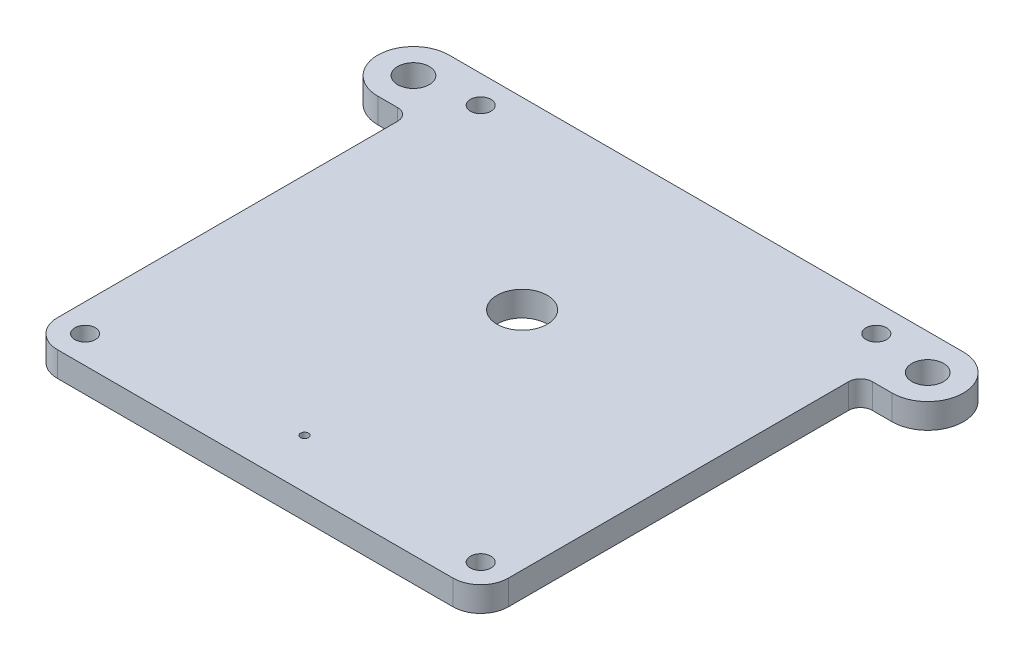
ISO-10303-21;
HEADER;
FILE_DESCRIPTION(('STEP AP214'),'2;1');
FILE_NAME('part.step','',(''),(''),'','','');
FILE_SCHEMA(('AUTOMOTIVE_DESIGN { 1 0 10303 214 1 1 1 1 }'));
ENDSEC;
DATA;
#1=APPLICATION_CONTEXT('core data for automotive mechanical design processes');
#2=APPLICATION_PROTOCOL_DEFINITION('international standard','automotive_design',2000,#1);
#3=PRODUCT_CONTEXT('',#1,'mechanical');
#4=PRODUCT('Part','Part','',(#3));
#5=PRODUCT_RELATED_PRODUCT_CATEGORY('part','',(#4));
#6=PRODUCT_DEFINITION_FORMATION('','',#4);
#7=PRODUCT_DEFINITION_CONTEXT('part definition',#1,'design');
#8=PRODUCT_DEFINITION('design','',#6,#7);
#9=PRODUCT_DEFINITION_SHAPE('','',#8);
#10=(LENGTH_UNIT() NAMED_UNIT(*) SI_UNIT(.MILLI.,.METRE.));
#11=(NAMED_UNIT(*) PLANE_ANGLE_UNIT() SI_UNIT($,.RADIAN.));
#12=(NAMED_UNIT(*) SI_UNIT($,.STERADIAN.) SOLID_ANGLE_UNIT());
#13=UNCERTAINTY_MEASURE_WITH_UNIT(LENGTH_MEASURE(1.E-05),#10,'distance_accuracy_value','');
#14=(GEOMETRIC_REPRESENTATION_CONTEXT(3) GLOBAL_UNCERTAINTY_ASSIGNED_CONTEXT((#13)) GLOBAL_UNIT_ASSIGNED_CONTEXT((#10,
#11,#12)) REPRESENTATION_CONTEXT('',''));
#15=CARTESIAN_POINT('',(0.,0.,0.));
#16=DIRECTION('',(0.,0.,1.));
#17=DIRECTION('',(1.,0.,0.));
#18=AXIS2_PLACEMENT_3D('',#15,#16,#17);
#19=CARTESIAN_POINT('',(65.,6.3,9.));
#20=DIRECTION('',(0.,-1.,0.));
#21=DIRECTION('',(0.,0.,-1.));
#22=AXIS2_PLACEMENT_3D('',#19,#20,#21);
#23=PLANE('',#22);
#24=CARTESIAN_POINT('',(65.,6.3,9.));
#25=DIRECTION('',(0.,1.,0.));
#26=DIRECTION('',(0.,0.,-1.));
#27=AXIS2_PLACEMENT_3D('',#24,#25,#26);
#28=CIRCLE('',#27,9.);
#29=CARTESIAN_POINT('',(65.,6.3,18.));
#30=VERTEX_POINT('',#29);
#31=CARTESIAN_POINT('',(65.,6.3,0.));
#32=VERTEX_POINT('',#31);
#33=EDGE_CURVE('E202',#30,#32,#28,.T.);
#34=ORIENTED_EDGE('',*,*,#33,.T.);
#35=DIRECTION('',(-1.,0.,0.));
#36=VECTOR('',#35,1.);
#37=CARTESIAN_POINT('',(-65.,6.3,0.));
#38=LINE('',#37,#36);
#39=CARTESIAN_POINT('',(-65.,6.3,0.));
#40=VERTEX_POINT('',#39);
#41=EDGE_CURVE('E114',#32,#40,#38,.T.);
#42=ORIENTED_EDGE('',*,*,#41,.T.);
#43=CARTESIAN_POINT('',(-65.,6.3,9.00000000000002));
#44=DIRECTION('',(0.,1.,0.));
#45=DIRECTION('',(0.,0.,1.));
#46=AXIS2_PLACEMENT_3D('',#43,#44,#45);
#47=CIRCLE('',#46,9.);
#48=CARTESIAN_POINT('',(-65.,6.3,18.));
#49=VERTEX_POINT('',#48);
#50=EDGE_CURVE('E239',#40,#49,#47,.T.);
#51=ORIENTED_EDGE('',*,*,#50,.T.);
#52=DIRECTION('',(1.,0.,0.));
#53=VECTOR('',#52,1.);
#54=CARTESIAN_POINT('',(-65.,6.3,18.));
#55=LINE('',#54,#53);
#56=CARTESIAN_POINT('',(-60.,6.3,18.));
#57=VERTEX_POINT('',#56);
#58=EDGE_CURVE('E259',#49,#57,#55,.T.);
#59=ORIENTED_EDGE('',*,*,#58,.T.);
#60=CARTESIAN_POINT('',(-60.,6.3,21.));
#61=DIRECTION('',(0.,-1.,0.));
#62=DIRECTION('',(0.,0.,-1.));
#63=AXIS2_PLACEMENT_3D('',#60,#61,#62);
#64=CIRCLE('',#63,3.);
#65=CARTESIAN_POINT('',(-57.,6.3,21.));
#66=VERTEX_POINT('',#65);
#67=EDGE_CURVE('E255',#57,#66,#64,.T.);
#68=ORIENTED_EDGE('',*,*,#67,.T.);
#69=DIRECTION('',(0.,0.,1.));
#70=VECTOR('',#69,1.);
#71=CARTESIAN_POINT('',(-57.,6.3,21.));
#72=LINE('',#71,#70);
#73=CARTESIAN_POINT('',(-57.,6.3,107.));
#74=VERTEX_POINT('',#73);
#75=EDGE_CURVE('E258',#66,#74,#72,.T.);
#76=ORIENTED_EDGE('',*,*,#75,.T.);
#77=CARTESIAN_POINT('',(-50.,6.3,107.));
#78=DIRECTION('',(0.,1.,0.));
#79=DIRECTION('',(0.,0.,1.));
#80=AXIS2_PLACEMENT_3D('',#77,#78,#79);
#81=CIRCLE('',#80,7.00000000000001);
#82=CARTESIAN_POINT('',(-50.,6.3,114.));
#83=VERTEX_POINT('',#82);
#84=EDGE_CURVE('E263',#74,#83,#81,.T.);
#85=ORIENTED_EDGE('',*,*,#84,.T.);
#86=DIRECTION('',(1.,0.,0.));
#87=VECTOR('',#86,1.);
#88=CARTESIAN_POINT('',(50.,6.3,114.));
#89=LINE('',#88,#87);
#90=CARTESIAN_POINT('',(50.,6.3,114.));
#91=VERTEX_POINT('',#90);
#92=EDGE_CURVE('E270',#83,#91,#89,.T.);
#93=ORIENTED_EDGE('',*,*,#92,.T.);
#94=CARTESIAN_POINT('',(50.,6.3,107.));
#95=DIRECTION('',(0.,1.,0.));
#96=DIRECTION('',(0.,0.,-1.));
#97=AXIS2_PLACEMENT_3D('',#94,#95,#96);
#98=CIRCLE('',#97,7.00000000000001);
#99=CARTESIAN_POINT('',(57.,6.3,107.));
#100=VERTEX_POINT('',#99);
#101=EDGE_CURVE('E145',#91,#100,#98,.T.);
#102=ORIENTED_EDGE('',*,*,#101,.T.);
#103=DIRECTION('',(0.,0.,-1.));
#104=VECTOR('',#103,1.);
#105=CARTESIAN_POINT('',(57.,6.3,21.));
#106=LINE('',#105,#104);
#107=CARTESIAN_POINT('',(57.,6.3,21.));
#108=VERTEX_POINT('',#107);
#109=EDGE_CURVE('E139',#100,#108,#106,.T.);
#110=ORIENTED_EDGE('',*,*,#109,.T.);
#111=CARTESIAN_POINT('',(60.,6.3,21.));
#112=DIRECTION('',(0.,-1.,0.));
#113=DIRECTION('',(0.,0.,1.));
#114=AXIS2_PLACEMENT_3D('',#111,#112,#113);
#115=CIRCLE('',#114,3.);
#116=CARTESIAN_POINT('',(60.,6.3,18.));
#117=VERTEX_POINT('',#116);
#118=EDGE_CURVE('E143',#108,#117,#115,.T.);
#119=ORIENTED_EDGE('',*,*,#118,.T.);
#120=DIRECTION('',(1.,0.,0.));
#121=VECTOR('',#120,1.);
#122=CARTESIAN_POINT('',(65.,6.3,18.));
#123=LINE('',#122,#121);
#124=EDGE_CURVE('E59',#117,#30,#123,.T.);
#125=ORIENTED_EDGE('',*,*,#124,.T.);
#126=EDGE_LOOP('',(#34,#42,#51,#59,#68,#76,#85,#93,#102,#110,#119,#125));
#127=FACE_BOUND('',#126,.T.);
#128=CARTESIAN_POINT('',(50.,6.3,7.));
#129=DIRECTION('',(0.,1.,0.));
#130=DIRECTION('',(0.,0.,1.));
#131=AXIS2_PLACEMENT_3D('',#128,#129,#130);
#132=CIRCLE('',#131,2.6);
#133=CARTESIAN_POINT('',(50.,6.3,9.6));
#134=VERTEX_POINT('',#133);
#135=EDGE_CURVE('E172',#134,#134,#132,.T.);
#136=ORIENTED_EDGE('',*,*,#135,.F.);
#137=EDGE_LOOP('',(#136));
#138=FACE_BOUND('',#137,.T.);
#139=CARTESIAN_POINT('',(65.,6.3,9.));
#140=DIRECTION('',(0.,1.,0.));
#141=DIRECTION('',(0.,0.,1.));
#142=AXIS2_PLACEMENT_3D('',#139,#140,#141);
#143=CIRCLE('',#142,4.00000000000001);
#144=CARTESIAN_POINT('',(65.,6.3,13.));
#145=VERTEX_POINT('',#144);
#146=EDGE_CURVE('E388',#145,#145,#143,.T.);
#147=ORIENTED_EDGE('',*,*,#146,.F.);
#148=EDGE_LOOP('',(#147));
#149=FACE_BOUND('',#148,.T.);
#150=CARTESIAN_POINT('',(50.,6.3,107.));
#151=DIRECTION('',(0.,1.,0.));
#152=DIRECTION('',(0.,0.,1.));
#153=AXIS2_PLACEMENT_3D('',#150,#151,#152);
#154=CIRCLE('',#153,2.6);
#155=CARTESIAN_POINT('',(50.,6.3,109.6));
#156=VERTEX_POINT('',#155);
#157=EDGE_CURVE('E380',#156,#156,#154,.T.);
#158=ORIENTED_EDGE('',*,*,#157,.F.);
#159=EDGE_LOOP('',(#158));
#160=FACE_BOUND('',#159,.T.);
#161=CARTESIAN_POINT('',(-50.,6.3,107.));
#162=DIRECTION('',(0.,1.,0.));
#163=DIRECTION('',(0.,0.,-1.));
#164=AXIS2_PLACEMENT_3D('',#161,#162,#163);
#165=CIRCLE('',#164,2.6);
#166=CARTESIAN_POINT('',(-50.,6.3,104.4));
#167=VERTEX_POINT('',#166);
#168=EDGE_CURVE('E372',#167,#167,#165,.T.);
#169=ORIENTED_EDGE('',*,*,#168,.F.);
#170=EDGE_LOOP('',(#169));
#171=FACE_BOUND('',#170,.T.);
#172=CARTESIAN_POINT('',(0.,6.3,101.527767497325));
#173=DIRECTION('',(0.,1.,0.));
#174=DIRECTION('',(0.,0.,1.));
#175=AXIS2_PLACEMENT_3D('',#172,#173,#174);
#176=CIRCLE('',#175,1.);
#177=CARTESIAN_POINT('',(0.,6.3,102.527767497325));
#178=VERTEX_POINT('',#177);
#179=EDGE_CURVE('E364',#178,#178,#176,.T.);
#180=ORIENTED_EDGE('',*,*,#179,.F.);
#181=EDGE_LOOP('',(#180));
#182=FACE_BOUND('',#181,.T.);
#183=CARTESIAN_POINT('',(0.,6.3,46.5277674973255));
#184=DIRECTION('',(0.,1.,0.));
#185=DIRECTION('',(0.,0.,1.));
#186=AXIS2_PLACEMENT_3D('',#183,#184,#185);
#187=CIRCLE('',#186,6.35000000000001);
#188=CARTESIAN_POINT('',(0.,6.3,52.8777674973255));
#189=VERTEX_POINT('',#188);
#190=EDGE_CURVE('E356',#189,#189,#187,.T.);
#191=ORIENTED_EDGE('',*,*,#190,.F.);
#192=EDGE_LOOP('',(#191));
#193=FACE_BOUND('',#192,.T.);
#194=CARTESIAN_POINT('',(-65.,6.3,9.00000000000002));
#195=DIRECTION('',(0.,1.,0.));
#196=DIRECTION('',(0.,0.,-1.));
#197=AXIS2_PLACEMENT_3D('',#194,#195,#196);
#198=CIRCLE('',#197,4.00000000000001);
#199=CARTESIAN_POINT('',(-65.,6.3,5.00000000000001));
#200=VERTEX_POINT('',#199);
#201=EDGE_CURVE('E348',#200,#200,#198,.T.);
#202=ORIENTED_EDGE('',*,*,#201,.F.);
#203=EDGE_LOOP('',(#202));
#204=FACE_BOUND('',#203,.T.);
#205=CARTESIAN_POINT('',(-50.,6.3,7.00000000000001));
#206=DIRECTION('',(0.,1.,0.));
#207=DIRECTION('',(0.,0.,-1.));
#208=AXIS2_PLACEMENT_3D('',#205,#206,#207);
#209=CIRCLE('',#208,2.6);
#210=CARTESIAN_POINT('',(-50.,6.3,4.40000000000002));
#211=VERTEX_POINT('',#210);
#212=EDGE_CURVE('E337',#211,#211,#209,.T.);
#213=ORIENTED_EDGE('',*,*,#212,.F.);
#214=EDGE_LOOP('',(#213));
#215=FACE_BOUND('',#214,.T.);
#216=ADVANCED_FACE('F41',(#127,#138,#149,#160,#171,#182,#193,#204,#215),#23,.F.);
#217=CARTESIAN_POINT('',(65.,0.,9.));
#218=DIRECTION('',(0.,-1.,0.));
#219=DIRECTION('',(0.,0.,-1.));
#220=AXIS2_PLACEMENT_3D('',#217,#218,#219);
#221=PLANE('',#220);
#222=CARTESIAN_POINT('',(-65.,0.,9.00000000000002));
#223=DIRECTION('',(0.,1.,0.));
#224=DIRECTION('',(0.,0.,-1.));
#225=AXIS2_PLACEMENT_3D('',#222,#223,#224);
#226=CIRCLE('',#225,4.00000000000001);
#227=CARTESIAN_POINT('',(-65.,0.,5.00000000000001));
#228=VERTEX_POINT('',#227);
#229=EDGE_CURVE('E345',#228,#228,#226,.T.);
#230=ORIENTED_EDGE('',*,*,#229,.T.);
#231=EDGE_LOOP('',(#230));
#232=FACE_BOUND('',#231,.T.);
#233=CARTESIAN_POINT('',(0.,0.,101.527767497325));
#234=DIRECTION('',(0.,1.,0.));
#235=DIRECTION('',(0.,0.,1.));
#236=AXIS2_PLACEMENT_3D('',#233,#234,#235);
#237=CIRCLE('',#236,1.);
#238=CARTESIAN_POINT('',(0.,0.,102.527767497325));
#239=VERTEX_POINT('',#238);
#240=EDGE_CURVE('E360',#239,#239,#237,.T.);
#241=ORIENTED_EDGE('',*,*,#240,.T.);
#242=EDGE_LOOP('',(#241));
#243=FACE_BOUND('',#242,.T.);
#244=CARTESIAN_POINT('',(50.,0.,107.));
#245=DIRECTION('',(0.,1.,0.));
#246=DIRECTION('',(0.,0.,1.));
#247=AXIS2_PLACEMENT_3D('',#244,#245,#246);
#248=CIRCLE('',#247,2.6);
#249=CARTESIAN_POINT('',(50.,0.,109.6));
#250=VERTEX_POINT('',#249);
#251=EDGE_CURVE('E376',#250,#250,#248,.T.);
#252=ORIENTED_EDGE('',*,*,#251,.T.);
#253=EDGE_LOOP('',(#252));
#254=FACE_BOUND('',#253,.T.);
#255=CARTESIAN_POINT('',(50.,0.,7.));
#256=DIRECTION('',(0.,1.,0.));
#257=DIRECTION('',(0.,0.,1.));
#258=AXIS2_PLACEMENT_3D('',#255,#256,#257);
#259=CIRCLE('',#258,2.6);
#260=CARTESIAN_POINT('',(50.,0.,9.6));
#261=VERTEX_POINT('',#260);
#262=EDGE_CURVE('E392',#261,#261,#259,.T.);
#263=ORIENTED_EDGE('',*,*,#262,.T.);
#264=EDGE_LOOP('',(#263));
#265=FACE_BOUND('',#264,.T.);
#266=CARTESIAN_POINT('',(65.,0.,9.));
#267=DIRECTION('',(0.,1.,0.));
#268=DIRECTION('',(0.,0.,-1.));
#269=AXIS2_PLACEMENT_3D('',#266,#267,#268);
#270=CIRCLE('',#269,9.);
#271=CARTESIAN_POINT('',(65.,0.,18.));
#272=VERTEX_POINT('',#271);
#273=CARTESIAN_POINT('',(65.,0.,0.));
#274=VERTEX_POINT('',#273);
#275=EDGE_CURVE('E167',#272,#274,#270,.T.);
#276=ORIENTED_EDGE('',*,*,#275,.F.);
#277=DIRECTION('',(1.,0.,0.));
#278=VECTOR('',#277,1.);
#279=CARTESIAN_POINT('',(65.,0.,18.));
#280=LINE('',#279,#278);
#281=CARTESIAN_POINT('',(60.,0.,18.));
#282=VERTEX_POINT('',#281);
#283=EDGE_CURVE('E106',#282,#272,#280,.T.);
#284=ORIENTED_EDGE('',*,*,#283,.F.);
#285=CARTESIAN_POINT('',(60.,0.,21.));
#286=DIRECTION('',(0.,-1.,0.));
#287=DIRECTION('',(0.,0.,1.));
#288=AXIS2_PLACEMENT_3D('',#285,#286,#287);
#289=CIRCLE('',#288,3.);
#290=CARTESIAN_POINT('',(57.,0.,21.));
#291=VERTEX_POINT('',#290);
#292=EDGE_CURVE('E100',#291,#282,#289,.T.);
#293=ORIENTED_EDGE('',*,*,#292,.F.);
#294=DIRECTION('',(0.,0.,-1.));
#295=VECTOR('',#294,1.);
#296=CARTESIAN_POINT('',(57.,0.,21.));
#297=LINE('',#296,#295);
#298=CARTESIAN_POINT('',(57.,0.,107.));
#299=VERTEX_POINT('',#298);
#300=EDGE_CURVE('E154',#299,#291,#297,.T.);
#301=ORIENTED_EDGE('',*,*,#300,.F.);
#302=CARTESIAN_POINT('',(50.,0.,107.));
#303=DIRECTION('',(0.,1.,0.));
#304=DIRECTION('',(0.,0.,-1.));
#305=AXIS2_PLACEMENT_3D('',#302,#303,#304);
#306=CIRCLE('',#305,7.00000000000001);
#307=CARTESIAN_POINT('',(50.,0.,114.));
#308=VERTEX_POINT('',#307);
#309=EDGE_CURVE('E193',#308,#299,#306,.T.);
#310=ORIENTED_EDGE('',*,*,#309,.F.);
#311=DIRECTION('',(1.,0.,0.));
#312=VECTOR('',#311,1.);
#313=CARTESIAN_POINT('',(50.,0.,114.));
#314=LINE('',#313,#312);
#315=CARTESIAN_POINT('',(-50.,0.,114.));
#316=VERTEX_POINT('',#315);
#317=EDGE_CURVE('E190',#316,#308,#314,.T.);
#318=ORIENTED_EDGE('',*,*,#317,.F.);
#319=CARTESIAN_POINT('',(-50.,0.,107.));
#320=DIRECTION('',(0.,1.,0.));
#321=DIRECTION('',(0.,0.,1.));
#322=AXIS2_PLACEMENT_3D('',#319,#320,#321);
#323=CIRCLE('',#322,7.00000000000001);
#324=CARTESIAN_POINT('',(-57.,0.,107.));
#325=VERTEX_POINT('',#324);
#326=EDGE_CURVE('E187',#325,#316,#323,.T.);
#327=ORIENTED_EDGE('',*,*,#326,.F.);
#328=DIRECTION('',(0.,0.,1.));
#329=VECTOR('',#328,1.);
#330=CARTESIAN_POINT('',(-57.,0.,21.));
#331=LINE('',#330,#329);
#332=CARTESIAN_POINT('',(-57.,0.,21.));
#333=VERTEX_POINT('',#332);
#334=EDGE_CURVE('E184',#333,#325,#331,.T.);
#335=ORIENTED_EDGE('',*,*,#334,.F.);
#336=CARTESIAN_POINT('',(-60.,0.,21.));
#337=DIRECTION('',(0.,-1.,0.));
#338=DIRECTION('',(0.,0.,-1.));
#339=AXIS2_PLACEMENT_3D('',#336,#337,#338);
#340=CIRCLE('',#339,3.);
#341=CARTESIAN_POINT('',(-60.,0.,18.));
#342=VERTEX_POINT('',#341);
#343=EDGE_CURVE('E181',#342,#333,#340,.T.);
#344=ORIENTED_EDGE('',*,*,#343,.F.);
#345=DIRECTION('',(1.,0.,0.));
#346=VECTOR('',#345,1.);
#347=CARTESIAN_POINT('',(-65.,0.,18.));
#348=LINE('',#347,#346);
#349=CARTESIAN_POINT('',(-65.,0.,18.));
#350=VERTEX_POINT('',#349);
#351=EDGE_CURVE('E178',#350,#342,#348,.T.);
#352=ORIENTED_EDGE('',*,*,#351,.F.);
#353=CARTESIAN_POINT('',(-65.,0.,9.00000000000002));
#354=DIRECTION('',(0.,1.,0.));
#355=DIRECTION('',(0.,0.,1.));
#356=AXIS2_PLACEMENT_3D('',#353,#354,#355);
#357=CIRCLE('',#356,9.);
#358=CARTESIAN_POINT('',(-65.,0.,0.));
#359=VERTEX_POINT('',#358);
#360=EDGE_CURVE('E175',#359,#350,#357,.T.);
#361=ORIENTED_EDGE('',*,*,#360,.F.);
#362=DIRECTION('',(-1.,0.,0.));
#363=VECTOR('',#362,1.);
#364=CARTESIAN_POINT('',(-65.,0.,0.));
#365=LINE('',#364,#363);
#366=EDGE_CURVE('E171',#274,#359,#365,.T.);
#367=ORIENTED_EDGE('',*,*,#366,.F.);
#368=EDGE_LOOP('',(#276,#284,#293,#301,#310,#318,#327,#335,#344,#352,#361,#367));
#369=FACE_BOUND('',#368,.T.);
#370=CARTESIAN_POINT('',(65.,0.,9.));
#371=DIRECTION('',(0.,1.,0.));
#372=DIRECTION('',(0.,0.,1.));
#373=AXIS2_PLACEMENT_3D('',#370,#371,#372);
#374=CIRCLE('',#373,4.00000000000001);
#375=CARTESIAN_POINT('',(65.,0.,13.));
#376=VERTEX_POINT('',#375);
#377=EDGE_CURVE('E384',#376,#376,#374,.T.);
#378=ORIENTED_EDGE('',*,*,#377,.T.);
#379=EDGE_LOOP('',(#378));
#380=FACE_BOUND('',#379,.T.);
#381=CARTESIAN_POINT('',(-50.,0.,107.));
#382=DIRECTION('',(0.,1.,0.));
#383=DIRECTION('',(0.,0.,-1.));
#384=AXIS2_PLACEMENT_3D('',#381,#382,#383);
#385=CIRCLE('',#384,2.6);
#386=CARTESIAN_POINT('',(-50.,0.,104.4));
#387=VERTEX_POINT('',#386);
#388=EDGE_CURVE('E368',#387,#387,#385,.T.);
#389=ORIENTED_EDGE('',*,*,#388,.T.);
#390=EDGE_LOOP('',(#389));
#391=FACE_BOUND('',#390,.T.);
#392=CARTESIAN_POINT('',(0.,0.,46.5277674973255));
#393=DIRECTION('',(0.,1.,0.));
#394=DIRECTION('',(0.,0.,1.));
#395=AXIS2_PLACEMENT_3D('',#392,#393,#394);
#396=CIRCLE('',#395,6.35000000000001);
#397=CARTESIAN_POINT('',(0.,0.,52.8777674973255));
#398=VERTEX_POINT('',#397);
#399=EDGE_CURVE('E352',#398,#398,#396,.T.);
#400=ORIENTED_EDGE('',*,*,#399,.T.);
#401=EDGE_LOOP('',(#400));
#402=FACE_BOUND('',#401,.T.);
#403=CARTESIAN_POINT('',(-50.,0.,7.00000000000001));
#404=DIRECTION('',(0.,1.,0.));
#405=DIRECTION('',(0.,0.,-1.));
#406=AXIS2_PLACEMENT_3D('',#403,#404,#405);
#407=CIRCLE('',#406,2.6);
#408=CARTESIAN_POINT('',(-50.,0.,4.40000000000002));
#409=VERTEX_POINT('',#408);
#410=EDGE_CURVE('E340',#409,#409,#407,.T.);
#411=ORIENTED_EDGE('',*,*,#410,.T.);
#412=EDGE_LOOP('',(#411));
#413=FACE_BOUND('',#412,.T.);
#414=ADVANCED_FACE('F243',(#232,#243,#254,#265,#369,#380,#391,#402,#413),#221,.T.);
#415=CARTESIAN_POINT('',(65.,6.3,9.));
#416=DIRECTION('',(0.,-1.,0.));
#417=DIRECTION('',(0.,0.,-1.));
#418=AXIS2_PLACEMENT_3D('',#415,#416,#417);
#419=CYLINDRICAL_SURFACE('',#418,9.);
#420=ORIENTED_EDGE('',*,*,#275,.T.);
#421=DIRECTION('',(0.,-1.,0.));
#422=VECTOR('',#421,1.);
#423=CARTESIAN_POINT('',(65.,6.3,0.));
#424=LINE('',#423,#422);
#425=EDGE_CURVE('E11',#32,#274,#424,.T.);
#426=ORIENTED_EDGE('',*,*,#425,.F.);
#427=ORIENTED_EDGE('',*,*,#33,.F.);
#428=DIRECTION('',(0.,-1.,0.));
#429=VECTOR('',#428,1.);
#430=CARTESIAN_POINT('',(65.,6.3,18.));
#431=LINE('',#430,#429);
#432=EDGE_CURVE('E163',#30,#272,#431,.T.);
#433=ORIENTED_EDGE('',*,*,#432,.T.);
#434=EDGE_LOOP('',(#420,#426,#427,#433));
#435=FACE_BOUND('',#434,.T.);
#436=ADVANCED_FACE('F43',(#435),#419,.T.);
#437=CARTESIAN_POINT('',(-65.,6.3,0.));
#438=DIRECTION('',(0.,0.,1.));
#439=DIRECTION('',(1.,0.,0.));
#440=AXIS2_PLACEMENT_3D('',#437,#438,#439);
#441=PLANE('',#440);
#442=ORIENTED_EDGE('',*,*,#366,.T.);
#443=DIRECTION('',(0.,-1.,0.));
#444=VECTOR('',#443,1.);
#445=CARTESIAN_POINT('',(-65.,6.3,0.));
#446=LINE('',#445,#444);
#447=EDGE_CURVE('E51',#40,#359,#446,.T.);
#448=ORIENTED_EDGE('',*,*,#447,.F.);
#449=ORIENTED_EDGE('',*,*,#41,.F.);
#450=ORIENTED_EDGE('',*,*,#425,.T.);
#451=EDGE_LOOP('',(#442,#448,#449,#450));
#452=FACE_BOUND('',#451,.T.);
#453=ADVANCED_FACE('F546',(#452),#441,.F.);
#454=CARTESIAN_POINT('',(-65.,6.3,9.00000000000002));
#455=DIRECTION('',(0.,-1.,0.));
#456=DIRECTION('',(0.,0.,-1.));
#457=AXIS2_PLACEMENT_3D('',#454,#455,#456);
#458=CYLINDRICAL_SURFACE('',#457,9.);
#459=ORIENTED_EDGE('',*,*,#360,.T.);
#460=DIRECTION('',(0.,-1.,0.));
#461=VECTOR('',#460,1.);
#462=CARTESIAN_POINT('',(-65.,6.3,18.));
#463=LINE('',#462,#461);
#464=EDGE_CURVE('E229',#49,#350,#463,.T.);
#465=ORIENTED_EDGE('',*,*,#464,.F.);
#466=ORIENTED_EDGE('',*,*,#50,.F.);
#467=ORIENTED_EDGE('',*,*,#447,.T.);
#468=EDGE_LOOP('',(#459,#465,#466,#467));
#469=FACE_BOUND('',#468,.T.);
#470=ADVANCED_FACE('F237',(#469),#458,.T.);
#471=CARTESIAN_POINT('',(-65.,6.3,18.));
#472=DIRECTION('',(0.,0.,-1.));
#473=DIRECTION('',(-1.,0.,0.));
#474=AXIS2_PLACEMENT_3D('',#471,#472,#473);
#475=PLANE('',#474);
#476=ORIENTED_EDGE('',*,*,#351,.T.);
#477=DIRECTION('',(0.,-1.,0.));
#478=VECTOR('',#477,1.);
#479=CARTESIAN_POINT('',(-60.,6.3,18.));
#480=LINE('',#479,#478);
#481=EDGE_CURVE('E225',#57,#342,#480,.T.);
#482=ORIENTED_EDGE('',*,*,#481,.F.);
#483=ORIENTED_EDGE('',*,*,#58,.F.);
#484=ORIENTED_EDGE('',*,*,#464,.T.);
#485=EDGE_LOOP('',(#476,#482,#483,#484));
#486=FACE_BOUND('',#485,.T.);
#487=ADVANCED_FACE('F249',(#486),#475,.F.);
#488=CARTESIAN_POINT('',(-60.,6.3,21.));
#489=DIRECTION('',(0.,-1.,0.));
#490=DIRECTION('',(0.,0.,-1.));
#491=AXIS2_PLACEMENT_3D('',#488,#489,#490);
#492=CYLINDRICAL_SURFACE('',#491,3.);
#493=ORIENTED_EDGE('',*,*,#343,.T.);
#494=DIRECTION('',(0.,-1.,0.));
#495=VECTOR('',#494,1.);
#496=CARTESIAN_POINT('',(-57.,6.3,21.));
#497=LINE('',#496,#495);
#498=EDGE_CURVE('E221',#66,#333,#497,.T.);
#499=ORIENTED_EDGE('',*,*,#498,.F.);
#500=ORIENTED_EDGE('',*,*,#67,.F.);
#501=ORIENTED_EDGE('',*,*,#481,.T.);
#502=EDGE_LOOP('',(#493,#499,#500,#501));
#503=FACE_BOUND('',#502,.T.);
#504=ADVANCED_FACE('F253',(#503),#492,.F.);
#505=CARTESIAN_POINT('',(-57.,6.3,21.));
#506=DIRECTION('',(1.,0.,0.));
#507=DIRECTION('',(0.,0.,-1.));
#508=AXIS2_PLACEMENT_3D('',#505,#506,#507);
#509=PLANE('',#508);
#510=ORIENTED_EDGE('',*,*,#334,.T.);
#511=DIRECTION('',(0.,-1.,0.));
#512=VECTOR('',#511,1.);
#513=CARTESIAN_POINT('',(-57.,6.3,107.));
#514=LINE('',#513,#512);
#515=EDGE_CURVE('E217',#74,#325,#514,.T.);
#516=ORIENTED_EDGE('',*,*,#515,.F.);
#517=ORIENTED_EDGE('',*,*,#75,.F.);
#518=ORIENTED_EDGE('',*,*,#498,.T.);
#519=EDGE_LOOP('',(#510,#516,#517,#518));
#520=FACE_BOUND('',#519,.T.);
#521=ADVANCED_FACE('F511',(#520),#509,.F.);
#522=CARTESIAN_POINT('',(-50.,6.3,107.));
#523=DIRECTION('',(0.,-1.,0.));
#524=DIRECTION('',(0.,0.,-1.));
#525=AXIS2_PLACEMENT_3D('',#522,#523,#524);
#526=CYLINDRICAL_SURFACE('',#525,7.00000000000001);
#527=ORIENTED_EDGE('',*,*,#326,.T.);
#528=DIRECTION('',(0.,-1.,0.));
#529=VECTOR('',#528,1.);
#530=CARTESIAN_POINT('',(-50.,6.3,114.));
#531=LINE('',#530,#529);
#532=EDGE_CURVE('E213',#83,#316,#531,.T.);
#533=ORIENTED_EDGE('',*,*,#532,.F.);
#534=ORIENTED_EDGE('',*,*,#84,.F.);
#535=ORIENTED_EDGE('',*,*,#515,.T.);
#536=EDGE_LOOP('',(#527,#533,#534,#535));
#537=FACE_BOUND('',#536,.T.);
#538=ADVANCED_FACE('F502',(#537),#526,.T.);
#539=CARTESIAN_POINT('',(50.,6.3,114.));
#540=DIRECTION('',(0.,0.,-1.));
#541=DIRECTION('',(-1.,0.,0.));
#542=AXIS2_PLACEMENT_3D('',#539,#540,#541);
#543=PLANE('',#542);
#544=ORIENTED_EDGE('',*,*,#317,.T.);
#545=DIRECTION('',(0.,-1.,0.));
#546=VECTOR('',#545,1.);
#547=CARTESIAN_POINT('',(50.,6.3,114.));
#548=LINE('',#547,#546);
#549=EDGE_CURVE('E209',#91,#308,#548,.T.);
#550=ORIENTED_EDGE('',*,*,#549,.F.);
#551=ORIENTED_EDGE('',*,*,#92,.F.);
#552=ORIENTED_EDGE('',*,*,#532,.T.);
#553=EDGE_LOOP('',(#544,#550,#551,#552));
#554=FACE_BOUND('',#553,.T.);
#555=ADVANCED_FACE('F278',(#554),#543,.F.);
#556=CARTESIAN_POINT('',(50.,6.3,107.));
#557=DIRECTION('',(0.,-1.,0.));
#558=DIRECTION('',(0.,0.,-1.));
#559=AXIS2_PLACEMENT_3D('',#556,#557,#558);
#560=CYLINDRICAL_SURFACE('',#559,7.00000000000001);
#561=ORIENTED_EDGE('',*,*,#309,.T.);
#562=DIRECTION('',(0.,-1.,0.));
#563=VECTOR('',#562,1.);
#564=CARTESIAN_POINT('',(57.,6.3,107.));
#565=LINE('',#564,#563);
#566=EDGE_CURVE('E156',#100,#299,#565,.T.);
#567=ORIENTED_EDGE('',*,*,#566,.F.);
#568=ORIENTED_EDGE('',*,*,#101,.F.);
#569=ORIENTED_EDGE('',*,*,#549,.T.);
#570=EDGE_LOOP('',(#561,#567,#568,#569));
#571=FACE_BOUND('',#570,.T.);
#572=ADVANCED_FACE('F282',(#571),#560,.T.);
#573=CARTESIAN_POINT('',(57.,6.3,21.));
#574=DIRECTION('',(-1.,0.,0.));
#575=DIRECTION('',(0.,0.,1.));
#576=AXIS2_PLACEMENT_3D('',#573,#574,#575);
#577=PLANE('',#576);
#578=ORIENTED_EDGE('',*,*,#300,.T.);
#579=DIRECTION('',(0.,-1.,0.));
#580=VECTOR('',#579,1.);
#581=CARTESIAN_POINT('',(57.,6.3,21.));
#582=LINE('',#581,#580);
#583=EDGE_CURVE('E151',#108,#291,#582,.T.);
#584=ORIENTED_EDGE('',*,*,#583,.F.);
#585=ORIENTED_EDGE('',*,*,#109,.F.);
#586=ORIENTED_EDGE('',*,*,#566,.T.);
#587=EDGE_LOOP('',(#578,#584,#585,#586));
#588=FACE_BOUND('',#587,.T.);
#589=ADVANCED_FACE('F152',(#588),#577,.F.);
#590=CARTESIAN_POINT('',(60.,6.3,21.));
#591=DIRECTION('',(0.,-1.,0.));
#592=DIRECTION('',(0.,0.,-1.));
#593=AXIS2_PLACEMENT_3D('',#590,#591,#592);
#594=CYLINDRICAL_SURFACE('',#593,3.);
#595=ORIENTED_EDGE('',*,*,#292,.T.);
#596=DIRECTION('',(0.,-1.,0.));
#597=VECTOR('',#596,1.);
#598=CARTESIAN_POINT('',(60.,6.3,18.));
#599=LINE('',#598,#597);
#600=EDGE_CURVE('E157',#117,#282,#599,.T.);
#601=ORIENTED_EDGE('',*,*,#600,.F.);
#602=ORIENTED_EDGE('',*,*,#118,.F.);
#603=ORIENTED_EDGE('',*,*,#583,.T.);
#604=EDGE_LOOP('',(#595,#601,#602,#603));
#605=FACE_BOUND('',#604,.T.);
#606=ADVANCED_FACE('F159',(#605),#594,.F.);
#607=CARTESIAN_POINT('',(65.,6.3,18.));
#608=DIRECTION('',(0.,0.,-1.));
#609=DIRECTION('',(-1.,0.,0.));
#610=AXIS2_PLACEMENT_3D('',#607,#608,#609);
#611=PLANE('',#610);
#612=ORIENTED_EDGE('',*,*,#283,.T.);
#613=ORIENTED_EDGE('',*,*,#432,.F.);
#614=ORIENTED_EDGE('',*,*,#124,.F.);
#615=ORIENTED_EDGE('',*,*,#600,.T.);
#616=EDGE_LOOP('',(#612,#613,#614,#615));
#617=FACE_BOUND('',#616,.T.);
#618=ADVANCED_FACE('F286',(#617),#611,.F.);
#619=CARTESIAN_POINT('',(50.,6.3,7.));
#620=DIRECTION('',(0.,-1.,0.));
#621=DIRECTION('',(0.,0.,-1.));
#622=AXIS2_PLACEMENT_3D('',#619,#620,#621);
#623=CYLINDRICAL_SURFACE('',#622,2.6);
#624=ORIENTED_EDGE('',*,*,#135,.T.);
#625=EDGE_LOOP('',(#624));
#626=FACE_BOUND('',#625,.T.);
#627=ORIENTED_EDGE('',*,*,#262,.F.);
#628=EDGE_LOOP('',(#627));
#629=FACE_BOUND('',#628,.T.);
#630=ADVANCED_FACE('F288',(#626,#629),#623,.F.);
#631=CARTESIAN_POINT('',(65.,6.3,9.));
#632=DIRECTION('',(0.,-1.,0.));
#633=DIRECTION('',(0.,0.,-1.));
#634=AXIS2_PLACEMENT_3D('',#631,#632,#633);
#635=CYLINDRICAL_SURFACE('',#634,4.00000000000001);
#636=ORIENTED_EDGE('',*,*,#146,.T.);
#637=EDGE_LOOP('',(#636));
#638=FACE_BOUND('',#637,.T.);
#639=ORIENTED_EDGE('',*,*,#377,.F.);
#640=EDGE_LOOP('',(#639));
#641=FACE_BOUND('',#640,.T.);
#642=ADVANCED_FACE('F294',(#638,#641),#635,.F.);
#643=CARTESIAN_POINT('',(50.,6.3,107.));
#644=DIRECTION('',(0.,-1.,0.));
#645=DIRECTION('',(0.,0.,-1.));
#646=AXIS2_PLACEMENT_3D('',#643,#644,#645);
#647=CYLINDRICAL_SURFACE('',#646,2.6);
#648=ORIENTED_EDGE('',*,*,#157,.T.);
#649=EDGE_LOOP('',(#648));
#650=FACE_BOUND('',#649,.T.);
#651=ORIENTED_EDGE('',*,*,#251,.F.);
#652=EDGE_LOOP('',(#651));
#653=FACE_BOUND('',#652,.T.);
#654=ADVANCED_FACE('F308',(#650,#653),#647,.F.);
#655=CARTESIAN_POINT('',(-50.,6.3,107.));
#656=DIRECTION('',(0.,-1.,0.));
#657=DIRECTION('',(0.,0.,-1.));
#658=AXIS2_PLACEMENT_3D('',#655,#656,#657);
#659=CYLINDRICAL_SURFACE('',#658,2.6);
#660=ORIENTED_EDGE('',*,*,#168,.T.);
#661=EDGE_LOOP('',(#660));
#662=FACE_BOUND('',#661,.T.);
#663=ORIENTED_EDGE('',*,*,#388,.F.);
#664=EDGE_LOOP('',(#663));
#665=FACE_BOUND('',#664,.T.);
#666=ADVANCED_FACE('F312',(#662,#665),#659,.F.);
#667=CARTESIAN_POINT('',(0.,6.3,101.527767497325));
#668=DIRECTION('',(0.,-1.,0.));
#669=DIRECTION('',(0.,0.,-1.));
#670=AXIS2_PLACEMENT_3D('',#667,#668,#669);
#671=CYLINDRICAL_SURFACE('',#670,1.);
#672=ORIENTED_EDGE('',*,*,#179,.T.);
#673=EDGE_LOOP('',(#672));
#674=FACE_BOUND('',#673,.T.);
#675=ORIENTED_EDGE('',*,*,#240,.F.);
#676=EDGE_LOOP('',(#675));
#677=FACE_BOUND('',#676,.T.);
#678=ADVANCED_FACE('F316',(#674,#677),#671,.F.);
#679=CARTESIAN_POINT('',(0.,6.3,46.5277674973255));
#680=DIRECTION('',(0.,-1.,0.));
#681=DIRECTION('',(0.,0.,-1.));
#682=AXIS2_PLACEMENT_3D('',#679,#680,#681);
#683=CYLINDRICAL_SURFACE('',#682,6.35000000000001);
#684=ORIENTED_EDGE('',*,*,#190,.T.);
#685=EDGE_LOOP('',(#684));
#686=FACE_BOUND('',#685,.T.);
#687=ORIENTED_EDGE('',*,*,#399,.F.);
#688=EDGE_LOOP('',(#687));
#689=FACE_BOUND('',#688,.T.);
#690=ADVANCED_FACE('F320',(#686,#689),#683,.F.);
#691=CARTESIAN_POINT('',(-65.,6.3,9.00000000000002));
#692=DIRECTION('',(0.,-1.,0.));
#693=DIRECTION('',(0.,0.,-1.));
#694=AXIS2_PLACEMENT_3D('',#691,#692,#693);
#695=CYLINDRICAL_SURFACE('',#694,4.00000000000001);
#696=ORIENTED_EDGE('',*,*,#201,.T.);
#697=EDGE_LOOP('',(#696));
#698=FACE_BOUND('',#697,.T.);
#699=ORIENTED_EDGE('',*,*,#229,.F.);
#700=EDGE_LOOP('',(#699));
#701=FACE_BOUND('',#700,.T.);
#702=ADVANCED_FACE('F324',(#698,#701),#695,.F.);
#703=CARTESIAN_POINT('',(-50.,6.3,7.00000000000001));
#704=DIRECTION('',(0.,-1.,0.));
#705=DIRECTION('',(0.,0.,-1.));
#706=AXIS2_PLACEMENT_3D('',#703,#704,#705);
#707=CYLINDRICAL_SURFACE('',#706,2.6);
#708=ORIENTED_EDGE('',*,*,#212,.T.);
#709=EDGE_LOOP('',(#708));
#710=FACE_BOUND('',#709,.T.);
#711=ORIENTED_EDGE('',*,*,#410,.F.);
#712=EDGE_LOOP('',(#711));
#713=FACE_BOUND('',#712,.T.);
#714=ADVANCED_FACE('F328',(#710,#713),#707,.F.);
#715=CLOSED_SHELL('',(#216,#414,#436,#453,#470,#487,#504,#521,#538,#555,#572,#589,#606,#618,
#630,#642,#654,#666,#678,#690,#702,#714));
#716=MANIFOLD_SOLID_BREP('B2',#715);
#717=ADVANCED_BREP_SHAPE_REPRESENTATION('',(#18,#716),#14);
#718=SHAPE_DEFINITION_REPRESENTATION(#9,#717);
ENDSEC;
END-ISO-10303-21;
